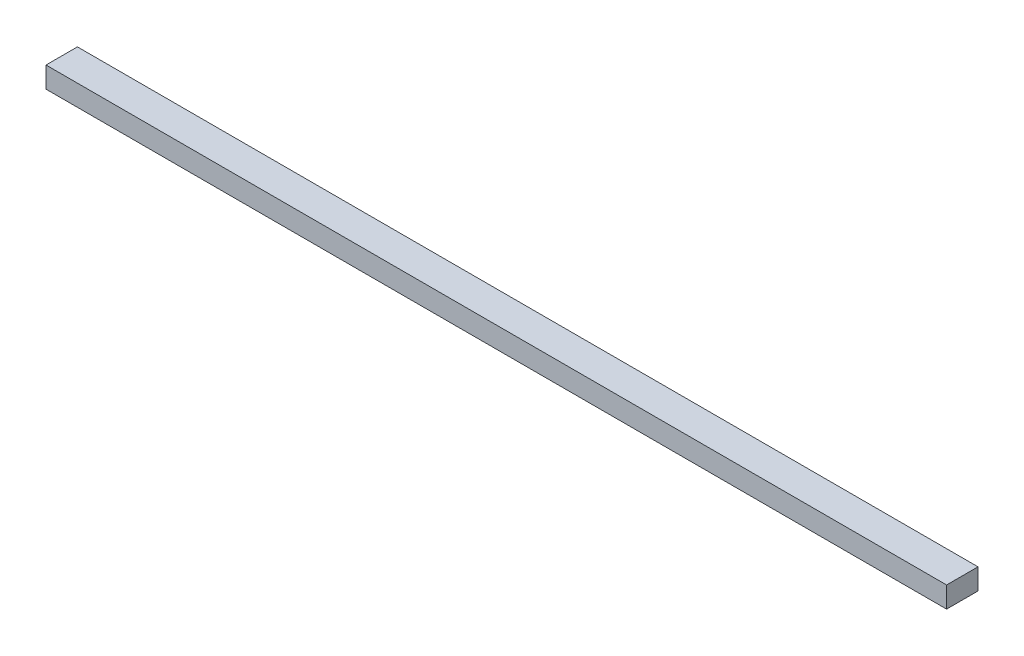
ISO-10303-21;
HEADER;
FILE_DESCRIPTION(('STEP AP214'),'2;1');
FILE_NAME('part.step','',(''),(''),'','','');
FILE_SCHEMA(('AUTOMOTIVE_DESIGN { 1 0 10303 214 1 1 1 1 }'));
ENDSEC;
DATA;
#1=APPLICATION_CONTEXT('core data for automotive mechanical design processes');
#2=APPLICATION_PROTOCOL_DEFINITION('international standard','automotive_design',2000,#1);
#3=PRODUCT_CONTEXT('',#1,'mechanical');
#4=PRODUCT('Part','Part','',(#3));
#5=PRODUCT_RELATED_PRODUCT_CATEGORY('part','',(#4));
#6=PRODUCT_DEFINITION_FORMATION('','',#4);
#7=PRODUCT_DEFINITION_CONTEXT('part definition',#1,'design');
#8=PRODUCT_DEFINITION('design','',#6,#7);
#9=PRODUCT_DEFINITION_SHAPE('','',#8);
#10=(LENGTH_UNIT() NAMED_UNIT(*) SI_UNIT(.MILLI.,.METRE.));
#11=(NAMED_UNIT(*) PLANE_ANGLE_UNIT() SI_UNIT($,.RADIAN.));
#12=(NAMED_UNIT(*) SI_UNIT($,.STERADIAN.) SOLID_ANGLE_UNIT());
#13=UNCERTAINTY_MEASURE_WITH_UNIT(LENGTH_MEASURE(1.E-05),#10,'distance_accuracy_value','');
#14=(GEOMETRIC_REPRESENTATION_CONTEXT(3) GLOBAL_UNCERTAINTY_ASSIGNED_CONTEXT((#13)) GLOBAL_UNIT_ASSIGNED_CONTEXT((#10,
#11,#12)) REPRESENTATION_CONTEXT('',''));
#15=CARTESIAN_POINT('',(0.,0.,0.));
#16=DIRECTION('',(0.,0.,1.));
#17=DIRECTION('',(1.,0.,0.));
#18=AXIS2_PLACEMENT_3D('',#15,#16,#17);
#19=CARTESIAN_POINT('',(42.9999999999999,0.999999999999999,3.));
#20=DIRECTION('',(-1.,0.,0.));
#21=DIRECTION('',(0.,0.,1.));
#22=AXIS2_PLACEMENT_3D('',#19,#20,#21);
#23=PLANE('',#22);
#24=DIRECTION('',(0.,1.,0.));
#25=VECTOR('',#24,1.);
#26=CARTESIAN_POINT('',(42.9999999999999,0.999999999999999,0.));
#27=LINE('',#26,#25);
#28=CARTESIAN_POINT('',(42.9999999999999,-1.,0.));
#29=VERTEX_POINT('',#28);
#30=CARTESIAN_POINT('',(42.9999999999999,0.999999999999999,0.));
#31=VERTEX_POINT('',#30);
#32=EDGE_CURVE('E107',#29,#31,#27,.T.);
#33=ORIENTED_EDGE('',*,*,#32,.T.);
#34=DIRECTION('',(0.,0.,-1.));
#35=VECTOR('',#34,1.);
#36=CARTESIAN_POINT('',(42.9999999999999,0.999999999999999,3.));
#37=LINE('',#36,#35);
#38=CARTESIAN_POINT('',(42.9999999999999,0.999999999999999,3.));
#39=VERTEX_POINT('',#38);
#40=EDGE_CURVE('E11',#39,#31,#37,.T.);
#41=ORIENTED_EDGE('',*,*,#40,.F.);
#42=DIRECTION('',(0.,1.,0.));
#43=VECTOR('',#42,1.);
#44=CARTESIAN_POINT('',(42.9999999999999,0.999999999999999,3.));
#45=LINE('',#44,#43);
#46=CARTESIAN_POINT('',(42.9999999999999,-1.,3.));
#47=VERTEX_POINT('',#46);
#48=EDGE_CURVE('E91',#47,#39,#45,.T.);
#49=ORIENTED_EDGE('',*,*,#48,.F.);
#50=DIRECTION('',(0.,0.,-1.));
#51=VECTOR('',#50,1.);
#52=CARTESIAN_POINT('',(42.9999999999999,-1.,3.));
#53=LINE('',#52,#51);
#54=EDGE_CURVE('E103',#47,#29,#53,.T.);
#55=ORIENTED_EDGE('',*,*,#54,.T.);
#56=EDGE_LOOP('',(#33,#41,#49,#55));
#57=FACE_BOUND('',#56,.T.);
#58=ADVANCED_FACE('F39',(#57),#23,.F.);
#59=CARTESIAN_POINT('',(-43.0000000000001,0.999999999999999,3.));
#60=DIRECTION('',(0.,-1.,0.));
#61=DIRECTION('',(0.,0.,-1.));
#62=AXIS2_PLACEMENT_3D('',#59,#60,#61);
#63=PLANE('',#62);
#64=DIRECTION('',(-1.,0.,0.));
#65=VECTOR('',#64,1.);
#66=CARTESIAN_POINT('',(-43.0000000000001,0.999999999999999,0.));
#67=LINE('',#66,#65);
#68=CARTESIAN_POINT('',(-43.0000000000001,0.999999999999999,0.));
#69=VERTEX_POINT('',#68);
#70=EDGE_CURVE('E96',#31,#69,#67,.T.);
#71=ORIENTED_EDGE('',*,*,#70,.T.);
#72=DIRECTION('',(0.,0.,-1.));
#73=VECTOR('',#72,1.);
#74=CARTESIAN_POINT('',(-43.0000000000001,0.999999999999999,3.));
#75=LINE('',#74,#73);
#76=CARTESIAN_POINT('',(-43.0000000000001,0.999999999999999,3.));
#77=VERTEX_POINT('',#76);
#78=EDGE_CURVE('E48',#77,#69,#75,.T.);
#79=ORIENTED_EDGE('',*,*,#78,.F.);
#80=DIRECTION('',(-1.,0.,0.));
#81=VECTOR('',#80,1.);
#82=CARTESIAN_POINT('',(-43.0000000000001,0.999999999999999,3.));
#83=LINE('',#82,#81);
#84=EDGE_CURVE('E86',#39,#77,#83,.T.);
#85=ORIENTED_EDGE('',*,*,#84,.F.);
#86=ORIENTED_EDGE('',*,*,#40,.T.);
#87=EDGE_LOOP('',(#71,#79,#85,#86));
#88=FACE_BOUND('',#87,.T.);
#89=ADVANCED_FACE('F95',(#88),#63,.F.);
#90=CARTESIAN_POINT('',(-43.0000000000001,0.999999999999999,3.));
#91=DIRECTION('',(1.,0.,0.));
#92=DIRECTION('',(0.,0.,-1.));
#93=AXIS2_PLACEMENT_3D('',#90,#91,#92);
#94=PLANE('',#93);
#95=DIRECTION('',(0.,-1.,0.));
#96=VECTOR('',#95,1.);
#97=CARTESIAN_POINT('',(-43.0000000000001,0.999999999999999,0.));
#98=LINE('',#97,#96);
#99=CARTESIAN_POINT('',(-43.0000000000001,-1.,0.));
#100=VERTEX_POINT('',#99);
#101=EDGE_CURVE('E73',#69,#100,#98,.T.);
#102=ORIENTED_EDGE('',*,*,#101,.T.);
#103=DIRECTION('',(0.,0.,-1.));
#104=VECTOR('',#103,1.);
#105=CARTESIAN_POINT('',(-43.0000000000001,-1.,3.));
#106=LINE('',#105,#104);
#107=CARTESIAN_POINT('',(-43.0000000000001,-1.,3.));
#108=VERTEX_POINT('',#107);
#109=EDGE_CURVE('E98',#108,#100,#106,.T.);
#110=ORIENTED_EDGE('',*,*,#109,.F.);
#111=DIRECTION('',(0.,-1.,0.));
#112=VECTOR('',#111,1.);
#113=CARTESIAN_POINT('',(-43.0000000000001,0.999999999999999,3.));
#114=LINE('',#113,#112);
#115=EDGE_CURVE('E89',#77,#108,#114,.T.);
#116=ORIENTED_EDGE('',*,*,#115,.F.);
#117=ORIENTED_EDGE('',*,*,#78,.T.);
#118=EDGE_LOOP('',(#102,#110,#116,#117));
#119=FACE_BOUND('',#118,.T.);
#120=ADVANCED_FACE('F99',(#119),#94,.F.);
#121=CARTESIAN_POINT('',(-43.0000000000001,-1.,3.));
#122=DIRECTION('',(0.,1.,0.));
#123=DIRECTION('',(0.,0.,1.));
#124=AXIS2_PLACEMENT_3D('',#121,#122,#123);
#125=PLANE('',#124);
#126=DIRECTION('',(1.,0.,0.));
#127=VECTOR('',#126,1.);
#128=CARTESIAN_POINT('',(-43.0000000000001,-1.,0.));
#129=LINE('',#128,#127);
#130=EDGE_CURVE('E79',#100,#29,#129,.T.);
#131=ORIENTED_EDGE('',*,*,#130,.T.);
#132=ORIENTED_EDGE('',*,*,#54,.F.);
#133=DIRECTION('',(1.,0.,0.));
#134=VECTOR('',#133,1.);
#135=CARTESIAN_POINT('',(-43.0000000000001,-1.,3.));
#136=LINE('',#135,#134);
#137=EDGE_CURVE('E56',#108,#47,#136,.T.);
#138=ORIENTED_EDGE('',*,*,#137,.F.);
#139=ORIENTED_EDGE('',*,*,#109,.T.);
#140=EDGE_LOOP('',(#131,#132,#138,#139));
#141=FACE_BOUND('',#140,.T.);
#142=ADVANCED_FACE('F120',(#141),#125,.F.);
#143=CARTESIAN_POINT('',(0.,0.,3.));
#144=DIRECTION('',(0.,0.,1.));
#145=DIRECTION('',(1.,0.,0.));
#146=AXIS2_PLACEMENT_3D('',#143,#144,#145);
#147=PLANE('',#146);
#148=ORIENTED_EDGE('',*,*,#48,.T.);
#149=ORIENTED_EDGE('',*,*,#84,.T.);
#150=ORIENTED_EDGE('',*,*,#115,.T.);
#151=ORIENTED_EDGE('',*,*,#137,.T.);
#152=EDGE_LOOP('',(#148,#149,#150,#151));
#153=FACE_BOUND('',#152,.T.);
#154=ADVANCED_FACE('F87',(#153),#147,.T.);
#155=CARTESIAN_POINT('',(0.,0.,0.));
#156=DIRECTION('',(0.,0.,1.));
#157=DIRECTION('',(1.,0.,0.));
#158=AXIS2_PLACEMENT_3D('',#155,#156,#157);
#159=PLANE('',#158);
#160=ORIENTED_EDGE('',*,*,#32,.F.);
#161=ORIENTED_EDGE('',*,*,#130,.F.);
#162=ORIENTED_EDGE('',*,*,#101,.F.);
#163=ORIENTED_EDGE('',*,*,#70,.F.);
#164=EDGE_LOOP('',(#160,#161,#162,#163));
#165=FACE_BOUND('',#164,.T.);
#166=ADVANCED_FACE('F123',(#165),#159,.F.);
#167=CLOSED_SHELL('',(#58,#89,#120,#142,#154,#166));
#168=MANIFOLD_SOLID_BREP('B2',#167);
#169=ADVANCED_BREP_SHAPE_REPRESENTATION('',(#18,#168),#14);
#170=SHAPE_DEFINITION_REPRESENTATION(#9,#169);
ENDSEC;
END-ISO-10303-21;
